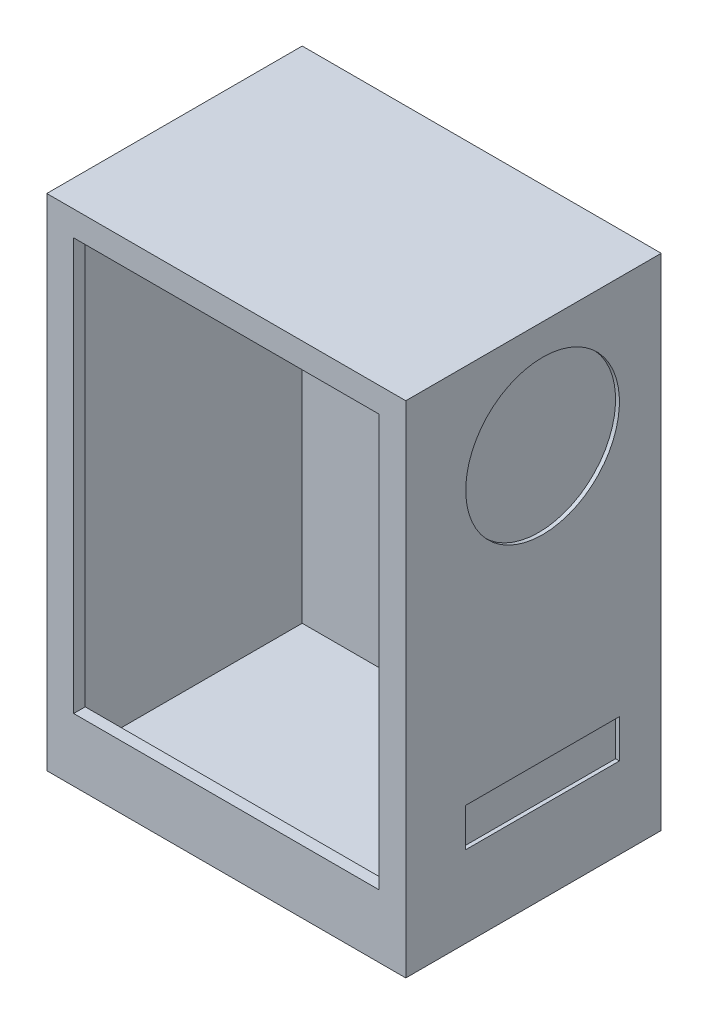
ISO-10303-21;
HEADER;
FILE_DESCRIPTION(('STEP AP214'),'2;1');
FILE_NAME('part.step','',(''),(''),'','','');
FILE_SCHEMA(('AUTOMOTIVE_DESIGN { 1 0 10303 214 1 1 1 1 }'));
ENDSEC;
DATA;
#1=APPLICATION_CONTEXT('core data for automotive mechanical design processes');
#2=APPLICATION_PROTOCOL_DEFINITION('international standard','automotive_design',2000,#1);
#3=PRODUCT_CONTEXT('',#1,'mechanical');
#4=PRODUCT('Part','Part','',(#3));
#5=PRODUCT_RELATED_PRODUCT_CATEGORY('part','',(#4));
#6=PRODUCT_DEFINITION_FORMATION('','',#4);
#7=PRODUCT_DEFINITION_CONTEXT('part definition',#1,'design');
#8=PRODUCT_DEFINITION('design','',#6,#7);
#9=PRODUCT_DEFINITION_SHAPE('','',#8);
#10=(LENGTH_UNIT() NAMED_UNIT(*) SI_UNIT(.MILLI.,.METRE.));
#11=(NAMED_UNIT(*) PLANE_ANGLE_UNIT() SI_UNIT($,.RADIAN.));
#12=(NAMED_UNIT(*) SI_UNIT($,.STERADIAN.) SOLID_ANGLE_UNIT());
#13=UNCERTAINTY_MEASURE_WITH_UNIT(LENGTH_MEASURE(1.E-05),#10,'distance_accuracy_value','');
#14=(GEOMETRIC_REPRESENTATION_CONTEXT(3) GLOBAL_UNCERTAINTY_ASSIGNED_CONTEXT((#13)) GLOBAL_UNIT_ASSIGNED_CONTEXT((#10,
#11,#12)) REPRESENTATION_CONTEXT('',''));
#15=CARTESIAN_POINT('',(0.,0.,0.));
#16=DIRECTION('',(0.,0.,1.));
#17=DIRECTION('',(1.,0.,0.));
#18=AXIS2_PLACEMENT_3D('',#15,#16,#17);
#19=CARTESIAN_POINT('',(23.36,0.,1.5));
#20=DIRECTION('',(1.,0.,0.));
#21=DIRECTION('',(0.,1.,0.));
#22=AXIS2_PLACEMENT_3D('',#19,#20,#21);
#23=PLANE('',#22);
#24=DIRECTION('',(0.,-1.,0.));
#25=VECTOR('',#24,1.);
#26=CARTESIAN_POINT('',(23.36,-19.445,-6.29999999999999));
#27=LINE('',#26,#25);
#28=CARTESIAN_POINT('',(23.36,-19.445,-6.29999999999999));
#29=VERTEX_POINT('',#28);
#30=CARTESIAN_POINT('',(23.36,-24.445,-6.29999999999999));
#31=VERTEX_POINT('',#30);
#32=EDGE_CURVE('E52',#29,#31,#27,.T.);
#33=ORIENTED_EDGE('',*,*,#32,.F.);
#34=DIRECTION('',(0.,0.,1.));
#35=VECTOR('',#34,1.);
#36=CARTESIAN_POINT('',(23.36,-19.445,-6.29999999999999));
#37=LINE('',#36,#35);
#38=CARTESIAN_POINT('',(23.36,-19.445,-26.3));
#39=VERTEX_POINT('',#38);
#40=EDGE_CURVE('E193',#39,#29,#37,.T.);
#41=ORIENTED_EDGE('',*,*,#40,.F.);
#42=DIRECTION('',(0.,1.,0.));
#43=VECTOR('',#42,1.);
#44=CARTESIAN_POINT('',(23.36,-19.445,-26.3));
#45=LINE('',#44,#43);
#46=CARTESIAN_POINT('',(23.36,-24.445,-26.3));
#47=VERTEX_POINT('',#46);
#48=EDGE_CURVE('E196',#47,#39,#45,.T.);
#49=ORIENTED_EDGE('',*,*,#48,.F.);
#50=DIRECTION('',(0.,0.,-1.));
#51=VECTOR('',#50,1.);
#52=CARTESIAN_POINT('',(23.36,-24.445,-6.29999999999999));
#53=LINE('',#52,#51);
#54=EDGE_CURVE('E202',#31,#47,#53,.T.);
#55=ORIENTED_EDGE('',*,*,#54,.F.);
#56=EDGE_LOOP('',(#33,#41,#49,#55));
#57=FACE_BOUND('',#56,.T.);
#58=CARTESIAN_POINT('',(23.36,16.055,-16.3));
#59=DIRECTION('',(1.,0.,0.));
#60=DIRECTION('',(0.,1.,0.));
#61=AXIS2_PLACEMENT_3D('',#58,#59,#60);
#62=CIRCLE('',#61,10.);
#63=CARTESIAN_POINT('',(23.36,26.055,-16.3));
#64=VERTEX_POINT('',#63);
#65=EDGE_CURVE('E215',#64,#64,#62,.T.);
#66=ORIENTED_EDGE('',*,*,#65,.F.);
#67=EDGE_LOOP('',(#66));
#68=FACE_BOUND('',#67,.T.);
#69=DIRECTION('',(0.,0.,-1.));
#70=VECTOR('',#69,1.);
#71=CARTESIAN_POINT('',(23.36,-35.005,1.5));
#72=LINE('',#71,#70);
#73=CARTESIAN_POINT('',(23.36,-35.005,1.5));
#74=VERTEX_POINT('',#73);
#75=CARTESIAN_POINT('',(23.36,-35.005,-31.74));
#76=VERTEX_POINT('',#75);
#77=EDGE_CURVE('E322',#74,#76,#72,.T.);
#78=ORIENTED_EDGE('',*,*,#77,.T.);
#79=DIRECTION('',(0.,-1.,0.));
#80=VECTOR('',#79,1.);
#81=CARTESIAN_POINT('',(23.36,0.,-31.74));
#82=LINE('',#81,#80);
#83=CARTESIAN_POINT('',(23.36,30.055,-31.74));
#84=VERTEX_POINT('',#83);
#85=EDGE_CURVE('E235',#84,#76,#82,.T.);
#86=ORIENTED_EDGE('',*,*,#85,.F.);
#87=DIRECTION('',(0.,0.,-1.));
#88=VECTOR('',#87,1.);
#89=CARTESIAN_POINT('',(23.36,30.055,1.5));
#90=LINE('',#89,#88);
#91=CARTESIAN_POINT('',(23.36,30.055,1.5));
#92=VERTEX_POINT('',#91);
#93=EDGE_CURVE('E11',#92,#84,#90,.T.);
#94=ORIENTED_EDGE('',*,*,#93,.F.);
#95=DIRECTION('',(0.,-1.,0.));
#96=VECTOR('',#95,1.);
#97=CARTESIAN_POINT('',(23.36,0.,1.5));
#98=LINE('',#97,#96);
#99=EDGE_CURVE('E301',#92,#74,#98,.T.);
#100=ORIENTED_EDGE('',*,*,#99,.T.);
#101=EDGE_LOOP('',(#78,#86,#94,#100));
#102=FACE_BOUND('',#101,.T.);
#103=ADVANCED_FACE('F35',(#57,#68,#102),#23,.T.);
#104=CARTESIAN_POINT('',(0.,30.055,1.5));
#105=DIRECTION('',(0.,1.,0.));
#106=DIRECTION('',(0.,0.,1.));
#107=AXIS2_PLACEMENT_3D('',#104,#105,#106);
#108=PLANE('',#107);
#109=ORIENTED_EDGE('',*,*,#93,.T.);
#110=DIRECTION('',(1.,0.,0.));
#111=VECTOR('',#110,1.);
#112=CARTESIAN_POINT('',(0.,30.055,-31.74));
#113=LINE('',#112,#111);
#114=CARTESIAN_POINT('',(-23.36,30.055,-31.74));
#115=VERTEX_POINT('',#114);
#116=EDGE_CURVE('E232',#115,#84,#113,.T.);
#117=ORIENTED_EDGE('',*,*,#116,.F.);
#118=DIRECTION('',(0.,0.,-1.));
#119=VECTOR('',#118,1.);
#120=CARTESIAN_POINT('',(-23.36,30.055,1.5));
#121=LINE('',#120,#119);
#122=CARTESIAN_POINT('',(-23.36,30.055,1.5));
#123=VERTEX_POINT('',#122);
#124=EDGE_CURVE('E44',#123,#115,#121,.T.);
#125=ORIENTED_EDGE('',*,*,#124,.F.);
#126=DIRECTION('',(1.,0.,0.));
#127=VECTOR('',#126,1.);
#128=CARTESIAN_POINT('',(0.,30.055,1.5));
#129=LINE('',#128,#127);
#130=EDGE_CURVE('E304',#123,#92,#129,.T.);
#131=ORIENTED_EDGE('',*,*,#130,.T.);
#132=EDGE_LOOP('',(#109,#117,#125,#131));
#133=FACE_BOUND('',#132,.T.);
#134=ADVANCED_FACE('F359',(#133),#108,.T.);
#135=CARTESIAN_POINT('',(-23.36,0.,1.5));
#136=DIRECTION('',(1.,0.,0.));
#137=DIRECTION('',(0.,1.,0.));
#138=AXIS2_PLACEMENT_3D('',#135,#136,#137);
#139=PLANE('',#138);
#140=ORIENTED_EDGE('',*,*,#124,.T.);
#141=DIRECTION('',(0.,1.,0.));
#142=VECTOR('',#141,1.);
#143=CARTESIAN_POINT('',(-23.36,0.,-31.74));
#144=LINE('',#143,#142);
#145=CARTESIAN_POINT('',(-23.36,-35.005,-31.74));
#146=VERTEX_POINT('',#145);
#147=EDGE_CURVE('E229',#146,#115,#144,.T.);
#148=ORIENTED_EDGE('',*,*,#147,.F.);
#149=DIRECTION('',(0.,0.,-1.));
#150=VECTOR('',#149,1.);
#151=CARTESIAN_POINT('',(-23.36,-35.005,1.5));
#152=LINE('',#151,#150);
#153=CARTESIAN_POINT('',(-23.36,-35.005,1.5));
#154=VERTEX_POINT('',#153);
#155=EDGE_CURVE('E324',#154,#146,#152,.T.);
#156=ORIENTED_EDGE('',*,*,#155,.F.);
#157=DIRECTION('',(0.,-1.,0.));
#158=VECTOR('',#157,1.);
#159=CARTESIAN_POINT('',(-23.36,0.,1.5));
#160=LINE('',#159,#158);
#161=EDGE_CURVE('E307',#123,#154,#160,.T.);
#162=ORIENTED_EDGE('',*,*,#161,.F.);
#163=EDGE_LOOP('',(#140,#148,#156,#162));
#164=FACE_BOUND('',#163,.T.);
#165=ADVANCED_FACE('F365',(#164),#139,.F.);
#166=CARTESIAN_POINT('',(-19.86,0.,1.5));
#167=DIRECTION('',(1.,0.,0.));
#168=DIRECTION('',(0.,0.,-1.));
#169=AXIS2_PLACEMENT_3D('',#166,#167,#168);
#170=PLANE('',#169);
#171=DIRECTION('',(0.,-1.,0.));
#172=VECTOR('',#171,1.);
#173=CARTESIAN_POINT('',(-19.86,0.,0.));
#174=LINE('',#173,#172);
#175=CARTESIAN_POINT('',(-19.86,26.805,0.));
#176=VERTEX_POINT('',#175);
#177=CARTESIAN_POINT('',(-19.86,-26.805,0.));
#178=VERTEX_POINT('',#177);
#179=EDGE_CURVE('E289',#176,#178,#174,.T.);
#180=ORIENTED_EDGE('',*,*,#179,.F.);
#181=DIRECTION('',(0.,0.,-1.));
#182=VECTOR('',#181,1.);
#183=CARTESIAN_POINT('',(-19.86,26.805,1.5));
#184=LINE('',#183,#182);
#185=CARTESIAN_POINT('',(-19.86,26.805,1.5));
#186=VERTEX_POINT('',#185);
#187=EDGE_CURVE('E39',#186,#176,#184,.T.);
#188=ORIENTED_EDGE('',*,*,#187,.F.);
#189=DIRECTION('',(0.,-1.,0.));
#190=VECTOR('',#189,1.);
#191=CARTESIAN_POINT('',(-19.86,0.,1.5));
#192=LINE('',#191,#190);
#193=CARTESIAN_POINT('',(-19.86,-26.805,1.5));
#194=VERTEX_POINT('',#193);
#195=EDGE_CURVE('E290',#186,#194,#192,.T.);
#196=ORIENTED_EDGE('',*,*,#195,.T.);
#197=DIRECTION('',(0.,0.,-1.));
#198=VECTOR('',#197,1.);
#199=CARTESIAN_POINT('',(-19.86,-26.805,1.5));
#200=LINE('',#199,#198);
#201=EDGE_CURVE('E312',#194,#178,#200,.T.);
#202=ORIENTED_EDGE('',*,*,#201,.T.);
#203=EDGE_LOOP('',(#180,#188,#196,#202));
#204=FACE_BOUND('',#203,.T.);
#205=ADVANCED_FACE('F37',(#204),#170,.T.);
#206=CARTESIAN_POINT('',(0.,26.805,1.5));
#207=DIRECTION('',(0.,1.,0.));
#208=DIRECTION('',(0.,0.,1.));
#209=AXIS2_PLACEMENT_3D('',#206,#207,#208);
#210=PLANE('',#209);
#211=DIRECTION('',(1.,0.,0.));
#212=VECTOR('',#211,1.);
#213=CARTESIAN_POINT('',(0.,26.805,0.));
#214=LINE('',#213,#212);
#215=CARTESIAN_POINT('',(19.86,26.805,0.));
#216=VERTEX_POINT('',#215);
#217=EDGE_CURVE('E315',#176,#216,#214,.T.);
#218=ORIENTED_EDGE('',*,*,#217,.T.);
#219=DIRECTION('',(0.,0.,-1.));
#220=VECTOR('',#219,1.);
#221=CARTESIAN_POINT('',(19.86,26.805,1.5));
#222=LINE('',#221,#220);
#223=CARTESIAN_POINT('',(19.86,26.805,1.5));
#224=VERTEX_POINT('',#223);
#225=EDGE_CURVE('E329',#224,#216,#222,.T.);
#226=ORIENTED_EDGE('',*,*,#225,.F.);
#227=DIRECTION('',(1.,0.,0.));
#228=VECTOR('',#227,1.);
#229=CARTESIAN_POINT('',(0.,26.805,1.5));
#230=LINE('',#229,#228);
#231=EDGE_CURVE('E293',#186,#224,#230,.T.);
#232=ORIENTED_EDGE('',*,*,#231,.F.);
#233=ORIENTED_EDGE('',*,*,#187,.T.);
#234=EDGE_LOOP('',(#218,#226,#232,#233));
#235=FACE_BOUND('',#234,.T.);
#236=ADVANCED_FACE('F338',(#235),#210,.F.);
#237=CARTESIAN_POINT('',(19.86,0.,1.5));
#238=DIRECTION('',(1.,0.,0.));
#239=DIRECTION('',(0.,0.,-1.));
#240=AXIS2_PLACEMENT_3D('',#237,#238,#239);
#241=PLANE('',#240);
#242=DIRECTION('',(0.,-1.,0.));
#243=VECTOR('',#242,1.);
#244=CARTESIAN_POINT('',(19.86,0.,0.));
#245=LINE('',#244,#243);
#246=CARTESIAN_POINT('',(19.86,-26.805,0.));
#247=VERTEX_POINT('',#246);
#248=EDGE_CURVE('E317',#216,#247,#245,.T.);
#249=ORIENTED_EDGE('',*,*,#248,.T.);
#250=DIRECTION('',(0.,0.,-1.));
#251=VECTOR('',#250,1.);
#252=CARTESIAN_POINT('',(19.86,-26.805,1.5));
#253=LINE('',#252,#251);
#254=CARTESIAN_POINT('',(19.86,-26.805,1.5));
#255=VERTEX_POINT('',#254);
#256=EDGE_CURVE('E328',#255,#247,#253,.T.);
#257=ORIENTED_EDGE('',*,*,#256,.F.);
#258=DIRECTION('',(0.,-1.,0.));
#259=VECTOR('',#258,1.);
#260=CARTESIAN_POINT('',(19.86,0.,1.5));
#261=LINE('',#260,#259);
#262=EDGE_CURVE('E296',#224,#255,#261,.T.);
#263=ORIENTED_EDGE('',*,*,#262,.F.);
#264=ORIENTED_EDGE('',*,*,#225,.T.);
#265=EDGE_LOOP('',(#249,#257,#263,#264));
#266=FACE_BOUND('',#265,.T.);
#267=ADVANCED_FACE('F349',(#266),#241,.F.);
#268=CARTESIAN_POINT('',(0.,-26.805,1.5));
#269=DIRECTION('',(0.,1.,0.));
#270=DIRECTION('',(0.,0.,1.));
#271=AXIS2_PLACEMENT_3D('',#268,#269,#270);
#272=PLANE('',#271);
#273=DIRECTION('',(1.,0.,0.));
#274=VECTOR('',#273,1.);
#275=CARTESIAN_POINT('',(0.,-26.805,0.));
#276=LINE('',#275,#274);
#277=EDGE_CURVE('E294',#178,#247,#276,.T.);
#278=ORIENTED_EDGE('',*,*,#277,.F.);
#279=ORIENTED_EDGE('',*,*,#201,.F.);
#280=DIRECTION('',(1.,0.,0.));
#281=VECTOR('',#280,1.);
#282=CARTESIAN_POINT('',(0.,-26.805,1.5));
#283=LINE('',#282,#281);
#284=EDGE_CURVE('E298',#194,#255,#283,.T.);
#285=ORIENTED_EDGE('',*,*,#284,.T.);
#286=ORIENTED_EDGE('',*,*,#256,.T.);
#287=EDGE_LOOP('',(#278,#279,#285,#286));
#288=FACE_BOUND('',#287,.T.);
#289=ADVANCED_FACE('F347',(#288),#272,.T.);
#290=CARTESIAN_POINT('',(0.,-35.005,1.5));
#291=DIRECTION('',(0.,1.,0.));
#292=DIRECTION('',(0.,0.,1.));
#293=AXIS2_PLACEMENT_3D('',#290,#291,#292);
#294=PLANE('',#293);
#295=ORIENTED_EDGE('',*,*,#155,.T.);
#296=DIRECTION('',(-1.,0.,0.));
#297=VECTOR('',#296,1.);
#298=CARTESIAN_POINT('',(0.,-35.005,-31.74));
#299=LINE('',#298,#297);
#300=EDGE_CURVE('E238',#76,#146,#299,.T.);
#301=ORIENTED_EDGE('',*,*,#300,.F.);
#302=ORIENTED_EDGE('',*,*,#77,.F.);
#303=DIRECTION('',(1.,0.,0.));
#304=VECTOR('',#303,1.);
#305=CARTESIAN_POINT('',(0.,-35.005,1.5));
#306=LINE('',#305,#304);
#307=EDGE_CURVE('E310',#154,#74,#306,.T.);
#308=ORIENTED_EDGE('',*,*,#307,.F.);
#309=EDGE_LOOP('',(#295,#301,#302,#308));
#310=FACE_BOUND('',#309,.T.);
#311=ADVANCED_FACE('F356',(#310),#294,.F.);
#312=CARTESIAN_POINT('',(0.,0.,1.5));
#313=DIRECTION('',(0.,0.,1.));
#314=DIRECTION('',(1.,0.,0.));
#315=AXIS2_PLACEMENT_3D('',#312,#313,#314);
#316=PLANE('',#315);
#317=ORIENTED_EDGE('',*,*,#195,.F.);
#318=ORIENTED_EDGE('',*,*,#231,.T.);
#319=ORIENTED_EDGE('',*,*,#262,.T.);
#320=ORIENTED_EDGE('',*,*,#284,.F.);
#321=EDGE_LOOP('',(#317,#318,#319,#320));
#322=FACE_BOUND('',#321,.T.);
#323=ORIENTED_EDGE('',*,*,#99,.F.);
#324=ORIENTED_EDGE('',*,*,#130,.F.);
#325=ORIENTED_EDGE('',*,*,#161,.T.);
#326=ORIENTED_EDGE('',*,*,#307,.T.);
#327=EDGE_LOOP('',(#323,#324,#325,#326));
#328=FACE_BOUND('',#327,.T.);
#329=ADVANCED_FACE('F375',(#322,#328),#316,.T.);
#330=CARTESIAN_POINT('',(0.,0.,0.));
#331=DIRECTION('',(0.,0.,1.));
#332=DIRECTION('',(1.,0.,0.));
#333=AXIS2_PLACEMENT_3D('',#330,#331,#332);
#334=PLANE('',#333);
#335=DIRECTION('',(0.,-1.,0.));
#336=VECTOR('',#335,1.);
#337=CARTESIAN_POINT('',(-21.86,0.,0.));
#338=LINE('',#337,#336);
#339=CARTESIAN_POINT('',(-21.86,28.555,0.));
#340=VERTEX_POINT('',#339);
#341=CARTESIAN_POINT('',(-21.86,-33.505,0.));
#342=VERTEX_POINT('',#341);
#343=EDGE_CURVE('E272',#340,#342,#338,.T.);
#344=ORIENTED_EDGE('',*,*,#343,.F.);
#345=DIRECTION('',(1.,0.,0.));
#346=VECTOR('',#345,1.);
#347=CARTESIAN_POINT('',(0.,28.555,0.));
#348=LINE('',#347,#346);
#349=CARTESIAN_POINT('',(21.86,28.555,0.));
#350=VERTEX_POINT('',#349);
#351=EDGE_CURVE('E60',#340,#350,#348,.T.);
#352=ORIENTED_EDGE('',*,*,#351,.T.);
#353=DIRECTION('',(0.,-1.,0.));
#354=VECTOR('',#353,1.);
#355=CARTESIAN_POINT('',(21.86,0.,0.));
#356=LINE('',#355,#354);
#357=CARTESIAN_POINT('',(21.86,-33.505,0.));
#358=VERTEX_POINT('',#357);
#359=EDGE_CURVE('E267',#350,#358,#356,.T.);
#360=ORIENTED_EDGE('',*,*,#359,.T.);
#361=DIRECTION('',(1.,0.,0.));
#362=VECTOR('',#361,1.);
#363=CARTESIAN_POINT('',(0.,-33.505,0.));
#364=LINE('',#363,#362);
#365=EDGE_CURVE('E269',#342,#358,#364,.T.);
#366=ORIENTED_EDGE('',*,*,#365,.F.);
#367=EDGE_LOOP('',(#344,#352,#360,#366));
#368=FACE_BOUND('',#367,.T.);
#369=ORIENTED_EDGE('',*,*,#179,.T.);
#370=ORIENTED_EDGE('',*,*,#277,.T.);
#371=ORIENTED_EDGE('',*,*,#248,.F.);
#372=ORIENTED_EDGE('',*,*,#217,.F.);
#373=EDGE_LOOP('',(#369,#370,#371,#372));
#374=FACE_BOUND('',#373,.T.);
#375=ADVANCED_FACE('F343',(#368,#374),#334,.F.);
#376=CARTESIAN_POINT('',(21.86,0.,-110.337203446812));
#377=DIRECTION('',(-1.,0.,0.));
#378=DIRECTION('',(0.,-1.,0.));
#379=AXIS2_PLACEMENT_3D('',#376,#377,#378);
#380=PLANE('',#379);
#381=DIRECTION('',(0.,0.,1.));
#382=VECTOR('',#381,1.);
#383=CARTESIAN_POINT('',(21.86,28.555,-110.337203446812));
#384=LINE('',#383,#382);
#385=CARTESIAN_POINT('',(21.86,28.555,-30.24));
#386=VERTEX_POINT('',#385);
#387=EDGE_CURVE('E275',#386,#350,#384,.T.);
#388=ORIENTED_EDGE('',*,*,#387,.F.);
#389=DIRECTION('',(0.,-1.,0.));
#390=VECTOR('',#389,1.);
#391=CARTESIAN_POINT('',(21.86,0.,-30.24));
#392=LINE('',#391,#390);
#393=CARTESIAN_POINT('',(21.86,-33.505,-30.24));
#394=VERTEX_POINT('',#393);
#395=EDGE_CURVE('E279',#386,#394,#392,.T.);
#396=ORIENTED_EDGE('',*,*,#395,.T.);
#397=DIRECTION('',(0.,0.,1.));
#398=VECTOR('',#397,1.);
#399=CARTESIAN_POINT('',(21.86,-33.505,-110.337203446812));
#400=LINE('',#399,#398);
#401=EDGE_CURVE('E283',#394,#358,#400,.T.);
#402=ORIENTED_EDGE('',*,*,#401,.T.);
#403=ORIENTED_EDGE('',*,*,#359,.F.);
#404=EDGE_LOOP('',(#388,#396,#402,#403));
#405=FACE_BOUND('',#404,.T.);
#406=ADVANCED_FACE('F379',(#405),#380,.T.);
#407=CARTESIAN_POINT('',(0.,-33.505,-110.337203446812));
#408=DIRECTION('',(0.,-1.,0.));
#409=DIRECTION('',(0.,0.,-1.));
#410=AXIS2_PLACEMENT_3D('',#407,#408,#409);
#411=PLANE('',#410);
#412=DIRECTION('',(1.,0.,0.));
#413=VECTOR('',#412,1.);
#414=CARTESIAN_POINT('',(0.,-33.505,-30.24));
#415=LINE('',#414,#413);
#416=CARTESIAN_POINT('',(-21.86,-33.505,-30.24));
#417=VERTEX_POINT('',#416);
#418=EDGE_CURVE('E259',#417,#394,#415,.T.);
#419=ORIENTED_EDGE('',*,*,#418,.F.);
#420=DIRECTION('',(0.,0.,1.));
#421=VECTOR('',#420,1.);
#422=CARTESIAN_POINT('',(-21.86,-33.505,-110.337203446812));
#423=LINE('',#422,#421);
#424=EDGE_CURVE('E280',#417,#342,#423,.T.);
#425=ORIENTED_EDGE('',*,*,#424,.T.);
#426=ORIENTED_EDGE('',*,*,#365,.T.);
#427=ORIENTED_EDGE('',*,*,#401,.F.);
#428=EDGE_LOOP('',(#419,#425,#426,#427));
#429=FACE_BOUND('',#428,.T.);
#430=ADVANCED_FACE('F391',(#429),#411,.F.);
#431=CARTESIAN_POINT('',(-21.86,0.,-110.337203446812));
#432=DIRECTION('',(-1.,0.,0.));
#433=DIRECTION('',(0.,-1.,0.));
#434=AXIS2_PLACEMENT_3D('',#431,#432,#433);
#435=PLANE('',#434);
#436=DIRECTION('',(0.,-1.,0.));
#437=VECTOR('',#436,1.);
#438=CARTESIAN_POINT('',(-21.86,0.,-30.24));
#439=LINE('',#438,#437);
#440=CARTESIAN_POINT('',(-21.86,28.555,-30.24));
#441=VERTEX_POINT('',#440);
#442=EDGE_CURVE('E261',#441,#417,#439,.T.);
#443=ORIENTED_EDGE('',*,*,#442,.F.);
#444=DIRECTION('',(0.,0.,1.));
#445=VECTOR('',#444,1.);
#446=CARTESIAN_POINT('',(-21.86,28.555,-110.337203446812));
#447=LINE('',#446,#445);
#448=EDGE_CURVE('E276',#441,#340,#447,.T.);
#449=ORIENTED_EDGE('',*,*,#448,.T.);
#450=ORIENTED_EDGE('',*,*,#343,.T.);
#451=ORIENTED_EDGE('',*,*,#424,.F.);
#452=EDGE_LOOP('',(#443,#449,#450,#451));
#453=FACE_BOUND('',#452,.T.);
#454=ADVANCED_FACE('F387',(#453),#435,.F.);
#455=CARTESIAN_POINT('',(0.,28.555,-110.337203446812));
#456=DIRECTION('',(0.,-1.,0.));
#457=DIRECTION('',(0.,0.,-1.));
#458=AXIS2_PLACEMENT_3D('',#455,#456,#457);
#459=PLANE('',#458);
#460=ORIENTED_EDGE('',*,*,#448,.F.);
#461=DIRECTION('',(1.,0.,0.));
#462=VECTOR('',#461,1.);
#463=CARTESIAN_POINT('',(0.,28.555,-30.24));
#464=LINE('',#463,#462);
#465=EDGE_CURVE('E263',#441,#386,#464,.T.);
#466=ORIENTED_EDGE('',*,*,#465,.T.);
#467=ORIENTED_EDGE('',*,*,#387,.T.);
#468=ORIENTED_EDGE('',*,*,#351,.F.);
#469=EDGE_LOOP('',(#460,#466,#467,#468));
#470=FACE_BOUND('',#469,.T.);
#471=ADVANCED_FACE('F383',(#470),#459,.T.);
#472=CARTESIAN_POINT('',(-6.092,0.,-31.74));
#473=DIRECTION('',(1.,0.,0.));
#474=DIRECTION('',(0.,0.,-1.));
#475=AXIS2_PLACEMENT_3D('',#472,#473,#474);
#476=PLANE('',#475);
#477=DIRECTION('',(0.,1.,0.));
#478=VECTOR('',#477,1.);
#479=CARTESIAN_POINT('',(-6.092,0.,-30.24));
#480=LINE('',#479,#478);
#481=CARTESIAN_POINT('',(-6.092,-24.195,-30.24));
#482=VERTEX_POINT('',#481);
#483=CARTESIAN_POINT('',(-6.092,26.355,-30.24));
#484=VERTEX_POINT('',#483);
#485=EDGE_CURVE('E209',#482,#484,#480,.T.);
#486=ORIENTED_EDGE('',*,*,#485,.F.);
#487=DIRECTION('',(0.,0.,1.));
#488=VECTOR('',#487,1.);
#489=CARTESIAN_POINT('',(-6.092,-24.195,-31.74));
#490=LINE('',#489,#488);
#491=CARTESIAN_POINT('',(-6.092,-24.195,-31.74));
#492=VERTEX_POINT('',#491);
#493=EDGE_CURVE('E257',#492,#482,#490,.T.);
#494=ORIENTED_EDGE('',*,*,#493,.F.);
#495=DIRECTION('',(0.,1.,0.));
#496=VECTOR('',#495,1.);
#497=CARTESIAN_POINT('',(-6.092,0.,-31.74));
#498=LINE('',#497,#496);
#499=CARTESIAN_POINT('',(-6.092,26.355,-31.74));
#500=VERTEX_POINT('',#499);
#501=EDGE_CURVE('E218',#492,#500,#498,.T.);
#502=ORIENTED_EDGE('',*,*,#501,.T.);
#503=DIRECTION('',(0.,0.,1.));
#504=VECTOR('',#503,1.);
#505=CARTESIAN_POINT('',(-6.092,26.355,-31.74));
#506=LINE('',#505,#504);
#507=EDGE_CURVE('E241',#500,#484,#506,.T.);
#508=ORIENTED_EDGE('',*,*,#507,.T.);
#509=EDGE_LOOP('',(#486,#494,#502,#508));
#510=FACE_BOUND('',#509,.T.);
#511=ADVANCED_FACE('F386',(#510),#476,.T.);
#512=CARTESIAN_POINT('',(0.,-24.195,-31.74));
#513=DIRECTION('',(0.,-1.,0.));
#514=DIRECTION('',(0.,0.,-1.));
#515=AXIS2_PLACEMENT_3D('',#512,#513,#514);
#516=PLANE('',#515);
#517=DIRECTION('',(1.,0.,0.));
#518=VECTOR('',#517,1.);
#519=CARTESIAN_POINT('',(0.,-24.195,-30.24));
#520=LINE('',#519,#518);
#521=CARTESIAN_POINT('',(19.613,-24.195,-30.24));
#522=VERTEX_POINT('',#521);
#523=EDGE_CURVE('E244',#482,#522,#520,.T.);
#524=ORIENTED_EDGE('',*,*,#523,.T.);
#525=DIRECTION('',(0.,0.,1.));
#526=VECTOR('',#525,1.);
#527=CARTESIAN_POINT('',(19.613,-24.195,-31.74));
#528=LINE('',#527,#526);
#529=CARTESIAN_POINT('',(19.613,-24.195,-31.74));
#530=VERTEX_POINT('',#529);
#531=EDGE_CURVE('E254',#530,#522,#528,.T.);
#532=ORIENTED_EDGE('',*,*,#531,.F.);
#533=DIRECTION('',(1.,0.,0.));
#534=VECTOR('',#533,1.);
#535=CARTESIAN_POINT('',(0.,-24.195,-31.74));
#536=LINE('',#535,#534);
#537=EDGE_CURVE('E221',#492,#530,#536,.T.);
#538=ORIENTED_EDGE('',*,*,#537,.F.);
#539=ORIENTED_EDGE('',*,*,#493,.T.);
#540=EDGE_LOOP('',(#524,#532,#538,#539));
#541=FACE_BOUND('',#540,.T.);
#542=ADVANCED_FACE('F401',(#541),#516,.F.);
#543=CARTESIAN_POINT('',(19.613,0.,-31.74));
#544=DIRECTION('',(1.,0.,0.));
#545=DIRECTION('',(0.,0.,-1.));
#546=AXIS2_PLACEMENT_3D('',#543,#544,#545);
#547=PLANE('',#546);
#548=DIRECTION('',(0.,1.,0.));
#549=VECTOR('',#548,1.);
#550=CARTESIAN_POINT('',(19.613,0.,-30.24));
#551=LINE('',#550,#549);
#552=CARTESIAN_POINT('',(19.613,26.355,-30.24));
#553=VERTEX_POINT('',#552);
#554=EDGE_CURVE('E246',#522,#553,#551,.T.);
#555=ORIENTED_EDGE('',*,*,#554,.T.);
#556=DIRECTION('',(0.,0.,1.));
#557=VECTOR('',#556,1.);
#558=CARTESIAN_POINT('',(19.613,26.355,-31.74));
#559=LINE('',#558,#557);
#560=CARTESIAN_POINT('',(19.613,26.355,-31.74));
#561=VERTEX_POINT('',#560);
#562=EDGE_CURVE('E252',#561,#553,#559,.T.);
#563=ORIENTED_EDGE('',*,*,#562,.F.);
#564=DIRECTION('',(0.,1.,0.));
#565=VECTOR('',#564,1.);
#566=CARTESIAN_POINT('',(19.613,0.,-31.74));
#567=LINE('',#566,#565);
#568=EDGE_CURVE('E224',#530,#561,#567,.T.);
#569=ORIENTED_EDGE('',*,*,#568,.F.);
#570=ORIENTED_EDGE('',*,*,#531,.T.);
#571=EDGE_LOOP('',(#555,#563,#569,#570));
#572=FACE_BOUND('',#571,.T.);
#573=ADVANCED_FACE('F405',(#572),#547,.F.);
#574=CARTESIAN_POINT('',(0.,26.355,-31.74));
#575=DIRECTION('',(0.,-1.,0.));
#576=DIRECTION('',(0.,0.,-1.));
#577=AXIS2_PLACEMENT_3D('',#574,#575,#576);
#578=PLANE('',#577);
#579=DIRECTION('',(1.,0.,0.));
#580=VECTOR('',#579,1.);
#581=CARTESIAN_POINT('',(0.,26.355,-30.24));
#582=LINE('',#581,#580);
#583=EDGE_CURVE('E222',#484,#553,#582,.T.);
#584=ORIENTED_EDGE('',*,*,#583,.F.);
#585=ORIENTED_EDGE('',*,*,#507,.F.);
#586=DIRECTION('',(1.,0.,0.));
#587=VECTOR('',#586,1.);
#588=CARTESIAN_POINT('',(0.,26.355,-31.74));
#589=LINE('',#588,#587);
#590=EDGE_CURVE('E226',#500,#561,#589,.T.);
#591=ORIENTED_EDGE('',*,*,#590,.T.);
#592=ORIENTED_EDGE('',*,*,#562,.T.);
#593=EDGE_LOOP('',(#584,#585,#591,#592));
#594=FACE_BOUND('',#593,.T.);
#595=ADVANCED_FACE('F409',(#594),#578,.T.);
#596=CARTESIAN_POINT('',(0.,0.,-31.74));
#597=DIRECTION('',(0.,0.,-1.));
#598=DIRECTION('',(0.,1.,0.));
#599=AXIS2_PLACEMENT_3D('',#596,#597,#598);
#600=PLANE('',#599);
#601=ORIENTED_EDGE('',*,*,#501,.F.);
#602=ORIENTED_EDGE('',*,*,#537,.T.);
#603=ORIENTED_EDGE('',*,*,#568,.T.);
#604=ORIENTED_EDGE('',*,*,#590,.F.);
#605=EDGE_LOOP('',(#601,#602,#603,#604));
#606=FACE_BOUND('',#605,.T.);
#607=ORIENTED_EDGE('',*,*,#147,.T.);
#608=ORIENTED_EDGE('',*,*,#116,.T.);
#609=ORIENTED_EDGE('',*,*,#85,.T.);
#610=ORIENTED_EDGE('',*,*,#300,.T.);
#611=EDGE_LOOP('',(#607,#608,#609,#610));
#612=FACE_BOUND('',#611,.T.);
#613=ADVANCED_FACE('F413',(#606,#612),#600,.T.);
#614=CARTESIAN_POINT('',(0.,0.,-30.24));
#615=DIRECTION('',(0.,0.,-1.));
#616=DIRECTION('',(0.,1.,0.));
#617=AXIS2_PLACEMENT_3D('',#614,#615,#616);
#618=PLANE('',#617);
#619=ORIENTED_EDGE('',*,*,#465,.F.);
#620=ORIENTED_EDGE('',*,*,#442,.T.);
#621=ORIENTED_EDGE('',*,*,#418,.T.);
#622=ORIENTED_EDGE('',*,*,#395,.F.);
#623=EDGE_LOOP('',(#619,#620,#621,#622));
#624=FACE_BOUND('',#623,.T.);
#625=ORIENTED_EDGE('',*,*,#485,.T.);
#626=ORIENTED_EDGE('',*,*,#583,.T.);
#627=ORIENTED_EDGE('',*,*,#554,.F.);
#628=ORIENTED_EDGE('',*,*,#523,.F.);
#629=EDGE_LOOP('',(#625,#626,#627,#628));
#630=FACE_BOUND('',#629,.T.);
#631=ADVANCED_FACE('F415',(#624,#630),#618,.F.);
#632=CARTESIAN_POINT('',(22.86,16.055,-16.3));
#633=DIRECTION('',(1.,0.,0.));
#634=DIRECTION('',(0.,1.,0.));
#635=AXIS2_PLACEMENT_3D('',#632,#633,#634);
#636=CYLINDRICAL_SURFACE('',#635,10.);
#637=CARTESIAN_POINT('',(22.86,16.055,-16.3));
#638=DIRECTION('',(1.,0.,0.));
#639=DIRECTION('',(0.,1.,0.));
#640=AXIS2_PLACEMENT_3D('',#637,#638,#639);
#641=CIRCLE('',#640,10.);
#642=CARTESIAN_POINT('',(22.86,26.055,-16.3));
#643=VERTEX_POINT('',#642);
#644=EDGE_CURVE('E203',#643,#643,#641,.T.);
#645=ORIENTED_EDGE('',*,*,#644,.F.);
#646=EDGE_LOOP('',(#645));
#647=FACE_BOUND('',#646,.T.);
#648=ORIENTED_EDGE('',*,*,#65,.T.);
#649=EDGE_LOOP('',(#648));
#650=FACE_BOUND('',#649,.T.);
#651=ADVANCED_FACE('F418',(#647,#650),#636,.F.);
#652=CARTESIAN_POINT('',(22.86,16.055,-16.3));
#653=DIRECTION('',(1.,0.,0.));
#654=DIRECTION('',(0.,1.,0.));
#655=AXIS2_PLACEMENT_3D('',#652,#653,#654);
#656=PLANE('',#655);
#657=ORIENTED_EDGE('',*,*,#644,.T.);
#658=EDGE_LOOP('',(#657));
#659=FACE_BOUND('',#658,.T.);
#660=ADVANCED_FACE('F425',(#659),#656,.T.);
#661=CARTESIAN_POINT('',(22.86,-19.445,-6.29999999999999));
#662=DIRECTION('',(0.,0.,1.));
#663=DIRECTION('',(1.,0.,0.));
#664=AXIS2_PLACEMENT_3D('',#661,#662,#663);
#665=PLANE('',#664);
#666=ORIENTED_EDGE('',*,*,#32,.T.);
#667=DIRECTION('',(1.,0.,0.));
#668=VECTOR('',#667,1.);
#669=CARTESIAN_POINT('',(22.86,-24.445,-6.29999999999999));
#670=LINE('',#669,#668);
#671=CARTESIAN_POINT('',(22.86,-24.445,-6.29999999999999));
#672=VERTEX_POINT('',#671);
#673=EDGE_CURVE('E171',#672,#31,#670,.T.);
#674=ORIENTED_EDGE('',*,*,#673,.F.);
#675=DIRECTION('',(0.,-1.,0.));
#676=VECTOR('',#675,1.);
#677=CARTESIAN_POINT('',(22.86,-19.445,-6.29999999999999));
#678=LINE('',#677,#676);
#679=CARTESIAN_POINT('',(22.86,-19.445,-6.29999999999999));
#680=VERTEX_POINT('',#679);
#681=EDGE_CURVE('E175',#680,#672,#678,.T.);
#682=ORIENTED_EDGE('',*,*,#681,.F.);
#683=DIRECTION('',(1.,0.,0.));
#684=VECTOR('',#683,1.);
#685=CARTESIAN_POINT('',(22.86,-19.445,-6.29999999999999));
#686=LINE('',#685,#684);
#687=EDGE_CURVE('E207',#680,#29,#686,.T.);
#688=ORIENTED_EDGE('',*,*,#687,.T.);
#689=EDGE_LOOP('',(#666,#674,#682,#688));
#690=FACE_BOUND('',#689,.T.);
#691=ADVANCED_FACE('F173',(#690),#665,.F.);
#692=CARTESIAN_POINT('',(22.86,-19.445,-6.29999999999999));
#693=DIRECTION('',(0.,1.,0.));
#694=DIRECTION('',(-1.,0.,0.));
#695=AXIS2_PLACEMENT_3D('',#692,#693,#694);
#696=PLANE('',#695);
#697=ORIENTED_EDGE('',*,*,#40,.T.);
#698=ORIENTED_EDGE('',*,*,#687,.F.);
#699=DIRECTION('',(0.,0.,1.));
#700=VECTOR('',#699,1.);
#701=CARTESIAN_POINT('',(22.86,-19.445,-6.29999999999999));
#702=LINE('',#701,#700);
#703=CARTESIAN_POINT('',(22.86,-19.445,-26.3));
#704=VERTEX_POINT('',#703);
#705=EDGE_CURVE('E181',#704,#680,#702,.T.);
#706=ORIENTED_EDGE('',*,*,#705,.F.);
#707=DIRECTION('',(1.,0.,0.));
#708=VECTOR('',#707,1.);
#709=CARTESIAN_POINT('',(22.86,-19.445,-26.3));
#710=LINE('',#709,#708);
#711=EDGE_CURVE('E210',#704,#39,#710,.T.);
#712=ORIENTED_EDGE('',*,*,#711,.T.);
#713=EDGE_LOOP('',(#697,#698,#706,#712));
#714=FACE_BOUND('',#713,.T.);
#715=ADVANCED_FACE('F432',(#714),#696,.F.);
#716=CARTESIAN_POINT('',(22.86,-19.445,-26.3));
#717=DIRECTION('',(0.,0.,-1.));
#718=DIRECTION('',(-1.,0.,0.));
#719=AXIS2_PLACEMENT_3D('',#716,#717,#718);
#720=PLANE('',#719);
#721=ORIENTED_EDGE('',*,*,#48,.T.);
#722=ORIENTED_EDGE('',*,*,#711,.F.);
#723=DIRECTION('',(0.,1.,0.));
#724=VECTOR('',#723,1.);
#725=CARTESIAN_POINT('',(22.86,-19.445,-26.3));
#726=LINE('',#725,#724);
#727=CARTESIAN_POINT('',(22.86,-24.445,-26.3));
#728=VERTEX_POINT('',#727);
#729=EDGE_CURVE('E189',#728,#704,#726,.T.);
#730=ORIENTED_EDGE('',*,*,#729,.F.);
#731=DIRECTION('',(1.,0.,0.));
#732=VECTOR('',#731,1.);
#733=CARTESIAN_POINT('',(22.86,-24.445,-26.3));
#734=LINE('',#733,#732);
#735=EDGE_CURVE('E180',#728,#47,#734,.T.);
#736=ORIENTED_EDGE('',*,*,#735,.T.);
#737=EDGE_LOOP('',(#721,#722,#730,#736));
#738=FACE_BOUND('',#737,.T.);
#739=ADVANCED_FACE('F435',(#738),#720,.F.);
#740=CARTESIAN_POINT('',(22.86,-24.445,-6.29999999999999));
#741=DIRECTION('',(0.,-1.,0.));
#742=DIRECTION('',(1.,0.,0.));
#743=AXIS2_PLACEMENT_3D('',#740,#741,#742);
#744=PLANE('',#743);
#745=ORIENTED_EDGE('',*,*,#54,.T.);
#746=ORIENTED_EDGE('',*,*,#735,.F.);
#747=DIRECTION('',(0.,0.,-1.));
#748=VECTOR('',#747,1.);
#749=CARTESIAN_POINT('',(22.86,-24.445,-6.29999999999999));
#750=LINE('',#749,#748);
#751=EDGE_CURVE('E184',#672,#728,#750,.T.);
#752=ORIENTED_EDGE('',*,*,#751,.F.);
#753=ORIENTED_EDGE('',*,*,#673,.T.);
#754=EDGE_LOOP('',(#745,#746,#752,#753));
#755=FACE_BOUND('',#754,.T.);
#756=ADVANCED_FACE('F185',(#755),#744,.F.);
#757=CARTESIAN_POINT('',(22.86,0.,0.));
#758=DIRECTION('',(1.,0.,0.));
#759=DIRECTION('',(0.,0.,-1.));
#760=AXIS2_PLACEMENT_3D('',#757,#758,#759);
#761=PLANE('',#760);
#762=ORIENTED_EDGE('',*,*,#681,.T.);
#763=ORIENTED_EDGE('',*,*,#751,.T.);
#764=ORIENTED_EDGE('',*,*,#729,.T.);
#765=ORIENTED_EDGE('',*,*,#705,.T.);
#766=EDGE_LOOP('',(#762,#763,#764,#765));
#767=FACE_BOUND('',#766,.T.);
#768=ADVANCED_FACE('F191',(#767),#761,.T.);
#769=CLOSED_SHELL('',(#103,#134,#165,#205,#236,#267,#289,#311,#329,#375,#406,#430,#454,#471,
#511,#542,#573,#595,#613,#631,#651,#660,#691,#715,#739,#756,#768));
#770=MANIFOLD_SOLID_BREP('B2',#769);
#771=ADVANCED_BREP_SHAPE_REPRESENTATION('',(#18,#770),#14);
#772=SHAPE_DEFINITION_REPRESENTATION(#9,#771);
ENDSEC;
END-ISO-10303-21;
